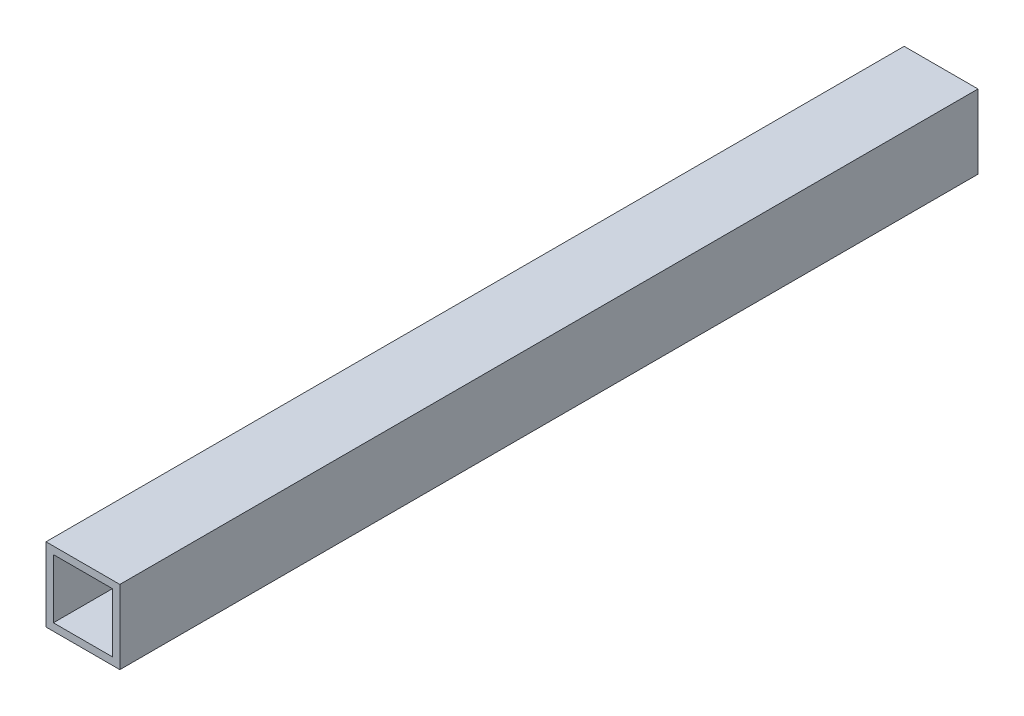
ISO-10303-21;
HEADER;
FILE_DESCRIPTION(('STEP AP214'),'2;1');
FILE_NAME('part.step','',(''),(''),'','','');
FILE_SCHEMA(('AUTOMOTIVE_DESIGN { 1 0 10303 214 1 1 1 1 }'));
ENDSEC;
DATA;
#1=APPLICATION_CONTEXT('core data for automotive mechanical design processes');
#2=APPLICATION_PROTOCOL_DEFINITION('international standard','automotive_design',2000,#1);
#3=PRODUCT_CONTEXT('',#1,'mechanical');
#4=PRODUCT('Part','Part','',(#3));
#5=PRODUCT_RELATED_PRODUCT_CATEGORY('part','',(#4));
#6=PRODUCT_DEFINITION_FORMATION('','',#4);
#7=PRODUCT_DEFINITION_CONTEXT('part definition',#1,'design');
#8=PRODUCT_DEFINITION('design','',#6,#7);
#9=PRODUCT_DEFINITION_SHAPE('','',#8);
#10=(LENGTH_UNIT() NAMED_UNIT(*) SI_UNIT(.MILLI.,.METRE.));
#11=(NAMED_UNIT(*) PLANE_ANGLE_UNIT() SI_UNIT($,.RADIAN.));
#12=(NAMED_UNIT(*) SI_UNIT($,.STERADIAN.) SOLID_ANGLE_UNIT());
#13=UNCERTAINTY_MEASURE_WITH_UNIT(LENGTH_MEASURE(1.E-05),#10,'distance_accuracy_value','');
#14=(GEOMETRIC_REPRESENTATION_CONTEXT(3) GLOBAL_UNCERTAINTY_ASSIGNED_CONTEXT((#13)) GLOBAL_UNIT_ASSIGNED_CONTEXT((#10,
#11,#12)) REPRESENTATION_CONTEXT('',''));
#15=CARTESIAN_POINT('',(0.,0.,0.));
#16=DIRECTION('',(0.,0.,1.));
#17=DIRECTION('',(1.,0.,0.));
#18=AXIS2_PLACEMENT_3D('',#15,#16,#17);
#19=CARTESIAN_POINT('',(0.,0.,232.4));
#20=DIRECTION('',(0.,0.,1.));
#21=DIRECTION('',(1.,0.,0.));
#22=AXIS2_PLACEMENT_3D('',#19,#20,#21);
#23=PLANE('',#22);
#24=DIRECTION('',(0.,-1.,0.));
#25=VECTOR('',#24,1.);
#26=CARTESIAN_POINT('',(0.,20.,232.4));
#27=LINE('',#26,#25);
#28=CARTESIAN_POINT('',(0.,20.,232.4));
#29=VERTEX_POINT('',#28);
#30=CARTESIAN_POINT('',(0.,0.,232.4));
#31=VERTEX_POINT('',#30);
#32=EDGE_CURVE('E185',#29,#31,#27,.T.);
#33=ORIENTED_EDGE('',*,*,#32,.T.);
#34=DIRECTION('',(1.,0.,0.));
#35=VECTOR('',#34,1.);
#36=CARTESIAN_POINT('',(0.,0.,232.4));
#37=LINE('',#36,#35);
#38=CARTESIAN_POINT('',(20.,0.,232.4));
#39=VERTEX_POINT('',#38);
#40=EDGE_CURVE('E189',#31,#39,#37,.T.);
#41=ORIENTED_EDGE('',*,*,#40,.T.);
#42=DIRECTION('',(0.,1.,0.));
#43=VECTOR('',#42,1.);
#44=CARTESIAN_POINT('',(20.,20.,232.4));
#45=LINE('',#44,#43);
#46=CARTESIAN_POINT('',(20.,20.,232.4));
#47=VERTEX_POINT('',#46);
#48=EDGE_CURVE('E193',#39,#47,#45,.T.);
#49=ORIENTED_EDGE('',*,*,#48,.T.);
#50=DIRECTION('',(-1.,0.,0.));
#51=VECTOR('',#50,1.);
#52=CARTESIAN_POINT('',(0.,20.,232.4));
#53=LINE('',#52,#51);
#54=EDGE_CURVE('E196',#47,#29,#53,.T.);
#55=ORIENTED_EDGE('',*,*,#54,.T.);
#56=EDGE_LOOP('',(#33,#41,#49,#55));
#57=FACE_BOUND('',#56,.T.);
#58=DIRECTION('',(1.,0.,0.));
#59=VECTOR('',#58,1.);
#60=CARTESIAN_POINT('',(0.,2.,232.4));
#61=LINE('',#60,#59);
#62=CARTESIAN_POINT('',(2.,2.,232.4));
#63=VERTEX_POINT('',#62);
#64=CARTESIAN_POINT('',(18.,2.,232.4));
#65=VERTEX_POINT('',#64);
#66=EDGE_CURVE('E146',#63,#65,#61,.T.);
#67=ORIENTED_EDGE('',*,*,#66,.F.);
#68=DIRECTION('',(0.,-1.,0.));
#69=VECTOR('',#68,1.);
#70=CARTESIAN_POINT('',(2.,20.,232.4));
#71=LINE('',#70,#69);
#72=CARTESIAN_POINT('',(2.,18.,232.4));
#73=VERTEX_POINT('',#72);
#74=EDGE_CURVE('E137',#73,#63,#71,.T.);
#75=ORIENTED_EDGE('',*,*,#74,.F.);
#76=DIRECTION('',(-1.,0.,0.));
#77=VECTOR('',#76,1.);
#78=CARTESIAN_POINT('',(0.,18.,232.4));
#79=LINE('',#78,#77);
#80=CARTESIAN_POINT('',(18.,18.,232.4));
#81=VERTEX_POINT('',#80);
#82=EDGE_CURVE('E163',#81,#73,#79,.T.);
#83=ORIENTED_EDGE('',*,*,#82,.F.);
#84=DIRECTION('',(0.,1.,0.));
#85=VECTOR('',#84,1.);
#86=CARTESIAN_POINT('',(18.,20.,232.4));
#87=LINE('',#86,#85);
#88=EDGE_CURVE('E159',#65,#81,#87,.T.);
#89=ORIENTED_EDGE('',*,*,#88,.F.);
#90=EDGE_LOOP('',(#67,#75,#83,#89));
#91=FACE_BOUND('',#90,.T.);
#92=ADVANCED_FACE('F71',(#57,#91),#23,.T.);
#93=CARTESIAN_POINT('',(0.,0.,0.));
#94=DIRECTION('',(0.,0.,1.));
#95=DIRECTION('',(1.,0.,0.));
#96=AXIS2_PLACEMENT_3D('',#93,#94,#95);
#97=PLANE('',#96);
#98=DIRECTION('',(0.,-1.,0.));
#99=VECTOR('',#98,1.);
#100=CARTESIAN_POINT('',(0.,20.,0.));
#101=LINE('',#100,#99);
#102=CARTESIAN_POINT('',(0.,20.,0.));
#103=VERTEX_POINT('',#102);
#104=CARTESIAN_POINT('',(0.,0.,0.));
#105=VERTEX_POINT('',#104);
#106=EDGE_CURVE('E155',#103,#105,#101,.T.);
#107=ORIENTED_EDGE('',*,*,#106,.F.);
#108=DIRECTION('',(-1.,0.,0.));
#109=VECTOR('',#108,1.);
#110=CARTESIAN_POINT('',(0.,20.,0.));
#111=LINE('',#110,#109);
#112=CARTESIAN_POINT('',(20.,20.,0.));
#113=VERTEX_POINT('',#112);
#114=EDGE_CURVE('E190',#113,#103,#111,.T.);
#115=ORIENTED_EDGE('',*,*,#114,.F.);
#116=DIRECTION('',(0.,1.,0.));
#117=VECTOR('',#116,1.);
#118=CARTESIAN_POINT('',(20.,20.,0.));
#119=LINE('',#118,#117);
#120=CARTESIAN_POINT('',(20.,0.,0.));
#121=VERTEX_POINT('',#120);
#122=EDGE_CURVE('E206',#121,#113,#119,.T.);
#123=ORIENTED_EDGE('',*,*,#122,.F.);
#124=DIRECTION('',(1.,0.,0.));
#125=VECTOR('',#124,1.);
#126=CARTESIAN_POINT('',(0.,0.,0.));
#127=LINE('',#126,#125);
#128=EDGE_CURVE('E203',#105,#121,#127,.T.);
#129=ORIENTED_EDGE('',*,*,#128,.F.);
#130=EDGE_LOOP('',(#107,#115,#123,#129));
#131=FACE_BOUND('',#130,.T.);
#132=DIRECTION('',(0.,-1.,0.));
#133=VECTOR('',#132,1.);
#134=CARTESIAN_POINT('',(2.,20.,0.));
#135=LINE('',#134,#133);
#136=CARTESIAN_POINT('',(2.,18.,0.));
#137=VERTEX_POINT('',#136);
#138=CARTESIAN_POINT('',(2.,2.,0.));
#139=VERTEX_POINT('',#138);
#140=EDGE_CURVE('E95',#137,#139,#135,.T.);
#141=ORIENTED_EDGE('',*,*,#140,.T.);
#142=DIRECTION('',(1.,0.,0.));
#143=VECTOR('',#142,1.);
#144=CARTESIAN_POINT('',(0.,2.,0.));
#145=LINE('',#144,#143);
#146=CARTESIAN_POINT('',(18.,2.,0.));
#147=VERTEX_POINT('',#146);
#148=EDGE_CURVE('E153',#139,#147,#145,.T.);
#149=ORIENTED_EDGE('',*,*,#148,.T.);
#150=DIRECTION('',(0.,1.,0.));
#151=VECTOR('',#150,1.);
#152=CARTESIAN_POINT('',(18.,20.,0.));
#153=LINE('',#152,#151);
#154=CARTESIAN_POINT('',(18.,18.,0.));
#155=VERTEX_POINT('',#154);
#156=EDGE_CURVE('E172',#147,#155,#153,.T.);
#157=ORIENTED_EDGE('',*,*,#156,.T.);
#158=DIRECTION('',(-1.,0.,0.));
#159=VECTOR('',#158,1.);
#160=CARTESIAN_POINT('',(0.,18.,0.));
#161=LINE('',#160,#159);
#162=EDGE_CURVE('E147',#155,#137,#161,.T.);
#163=ORIENTED_EDGE('',*,*,#162,.T.);
#164=EDGE_LOOP('',(#141,#149,#157,#163));
#165=FACE_BOUND('',#164,.T.);
#166=ADVANCED_FACE('F229',(#131,#165),#97,.F.);
#167=CARTESIAN_POINT('',(0.,20.,232.4));
#168=DIRECTION('',(1.,0.,0.));
#169=DIRECTION('',(0.,1.,0.));
#170=AXIS2_PLACEMENT_3D('',#167,#168,#169);
#171=PLANE('',#170);
#172=ORIENTED_EDGE('',*,*,#106,.T.);
#173=DIRECTION('',(0.,0.,-1.));
#174=VECTOR('',#173,1.);
#175=CARTESIAN_POINT('',(0.,0.,232.4));
#176=LINE('',#175,#174);
#177=EDGE_CURVE('E12',#31,#105,#176,.T.);
#178=ORIENTED_EDGE('',*,*,#177,.F.);
#179=ORIENTED_EDGE('',*,*,#32,.F.);
#180=DIRECTION('',(0.,0.,-1.));
#181=VECTOR('',#180,1.);
#182=CARTESIAN_POINT('',(0.,20.,232.4));
#183=LINE('',#182,#181);
#184=EDGE_CURVE('E199',#29,#103,#183,.T.);
#185=ORIENTED_EDGE('',*,*,#184,.T.);
#186=EDGE_LOOP('',(#172,#178,#179,#185));
#187=FACE_BOUND('',#186,.T.);
#188=ADVANCED_FACE('F73',(#187),#171,.F.);
#189=CARTESIAN_POINT('',(0.,0.,232.4));
#190=DIRECTION('',(0.,1.,0.));
#191=DIRECTION('',(0.,0.,1.));
#192=AXIS2_PLACEMENT_3D('',#189,#190,#191);
#193=PLANE('',#192);
#194=ORIENTED_EDGE('',*,*,#128,.T.);
#195=DIRECTION('',(0.,0.,-1.));
#196=VECTOR('',#195,1.);
#197=CARTESIAN_POINT('',(20.,0.,232.4));
#198=LINE('',#197,#196);
#199=EDGE_CURVE('E80',#39,#121,#198,.T.);
#200=ORIENTED_EDGE('',*,*,#199,.F.);
#201=ORIENTED_EDGE('',*,*,#40,.F.);
#202=ORIENTED_EDGE('',*,*,#177,.T.);
#203=EDGE_LOOP('',(#194,#200,#201,#202));
#204=FACE_BOUND('',#203,.T.);
#205=ADVANCED_FACE('F239',(#204),#193,.F.);
#206=CARTESIAN_POINT('',(20.,20.,232.4));
#207=DIRECTION('',(-1.,0.,0.));
#208=DIRECTION('',(0.,-1.,0.));
#209=AXIS2_PLACEMENT_3D('',#206,#207,#208);
#210=PLANE('',#209);
#211=ORIENTED_EDGE('',*,*,#122,.T.);
#212=DIRECTION('',(0.,0.,-1.));
#213=VECTOR('',#212,1.);
#214=CARTESIAN_POINT('',(20.,20.,232.4));
#215=LINE('',#214,#213);
#216=EDGE_CURVE('E214',#47,#113,#215,.T.);
#217=ORIENTED_EDGE('',*,*,#216,.F.);
#218=ORIENTED_EDGE('',*,*,#48,.F.);
#219=ORIENTED_EDGE('',*,*,#199,.T.);
#220=EDGE_LOOP('',(#211,#217,#218,#219));
#221=FACE_BOUND('',#220,.T.);
#222=ADVANCED_FACE('F223',(#221),#210,.F.);
#223=CARTESIAN_POINT('',(0.,20.,232.4));
#224=DIRECTION('',(0.,-1.,0.));
#225=DIRECTION('',(0.,0.,-1.));
#226=AXIS2_PLACEMENT_3D('',#223,#224,#225);
#227=PLANE('',#226);
#228=ORIENTED_EDGE('',*,*,#114,.T.);
#229=ORIENTED_EDGE('',*,*,#184,.F.);
#230=ORIENTED_EDGE('',*,*,#54,.F.);
#231=ORIENTED_EDGE('',*,*,#216,.T.);
#232=EDGE_LOOP('',(#228,#229,#230,#231));
#233=FACE_BOUND('',#232,.T.);
#234=ADVANCED_FACE('F233',(#233),#227,.F.);
#235=CARTESIAN_POINT('',(2.,20.,232.4));
#236=DIRECTION('',(1.,0.,0.));
#237=DIRECTION('',(0.,1.,0.));
#238=AXIS2_PLACEMENT_3D('',#235,#236,#237);
#239=PLANE('',#238);
#240=ORIENTED_EDGE('',*,*,#140,.F.);
#241=DIRECTION('',(0.,0.,-1.));
#242=VECTOR('',#241,1.);
#243=CARTESIAN_POINT('',(2.,18.,232.4));
#244=LINE('',#243,#242);
#245=EDGE_CURVE('E141',#73,#137,#244,.T.);
#246=ORIENTED_EDGE('',*,*,#245,.F.);
#247=ORIENTED_EDGE('',*,*,#74,.T.);
#248=DIRECTION('',(0.,0.,-1.));
#249=VECTOR('',#248,1.);
#250=CARTESIAN_POINT('',(2.,2.,232.4));
#251=LINE('',#250,#249);
#252=EDGE_CURVE('E140',#63,#139,#251,.T.);
#253=ORIENTED_EDGE('',*,*,#252,.T.);
#254=EDGE_LOOP('',(#240,#246,#247,#253));
#255=FACE_BOUND('',#254,.T.);
#256=ADVANCED_FACE('F139',(#255),#239,.T.);
#257=CARTESIAN_POINT('',(0.,2.,232.4));
#258=DIRECTION('',(0.,1.,0.));
#259=DIRECTION('',(0.,0.,1.));
#260=AXIS2_PLACEMENT_3D('',#257,#258,#259);
#261=PLANE('',#260);
#262=ORIENTED_EDGE('',*,*,#148,.F.);
#263=ORIENTED_EDGE('',*,*,#252,.F.);
#264=ORIENTED_EDGE('',*,*,#66,.T.);
#265=DIRECTION('',(0.,0.,-1.));
#266=VECTOR('',#265,1.);
#267=CARTESIAN_POINT('',(18.,2.,232.4));
#268=LINE('',#267,#266);
#269=EDGE_CURVE('E156',#65,#147,#268,.T.);
#270=ORIENTED_EDGE('',*,*,#269,.T.);
#271=EDGE_LOOP('',(#262,#263,#264,#270));
#272=FACE_BOUND('',#271,.T.);
#273=ADVANCED_FACE('F150',(#272),#261,.T.);
#274=CARTESIAN_POINT('',(18.,20.,232.4));
#275=DIRECTION('',(-1.,0.,0.));
#276=DIRECTION('',(0.,-1.,0.));
#277=AXIS2_PLACEMENT_3D('',#274,#275,#276);
#278=PLANE('',#277);
#279=ORIENTED_EDGE('',*,*,#156,.F.);
#280=ORIENTED_EDGE('',*,*,#269,.F.);
#281=ORIENTED_EDGE('',*,*,#88,.T.);
#282=DIRECTION('',(0.,0.,-1.));
#283=VECTOR('',#282,1.);
#284=CARTESIAN_POINT('',(18.,18.,232.4));
#285=LINE('',#284,#283);
#286=EDGE_CURVE('E87',#81,#155,#285,.T.);
#287=ORIENTED_EDGE('',*,*,#286,.T.);
#288=EDGE_LOOP('',(#279,#280,#281,#287));
#289=FACE_BOUND('',#288,.T.);
#290=ADVANCED_FACE('F262',(#289),#278,.T.);
#291=CARTESIAN_POINT('',(0.,18.,232.4));
#292=DIRECTION('',(0.,-1.,0.));
#293=DIRECTION('',(0.,0.,-1.));
#294=AXIS2_PLACEMENT_3D('',#291,#292,#293);
#295=PLANE('',#294);
#296=ORIENTED_EDGE('',*,*,#162,.F.);
#297=ORIENTED_EDGE('',*,*,#286,.F.);
#298=ORIENTED_EDGE('',*,*,#82,.T.);
#299=ORIENTED_EDGE('',*,*,#245,.T.);
#300=EDGE_LOOP('',(#296,#297,#298,#299));
#301=FACE_BOUND('',#300,.T.);
#302=ADVANCED_FACE('F266',(#301),#295,.T.);
#303=CLOSED_SHELL('',(#92,#166,#188,#205,#222,#234,#256,#273,#290,#302));
#304=MANIFOLD_SOLID_BREP('B2',#303);
#305=ADVANCED_BREP_SHAPE_REPRESENTATION('',(#18,#304),#14);
#306=SHAPE_DEFINITION_REPRESENTATION(#9,#305);
ENDSEC;
END-ISO-10303-21;
